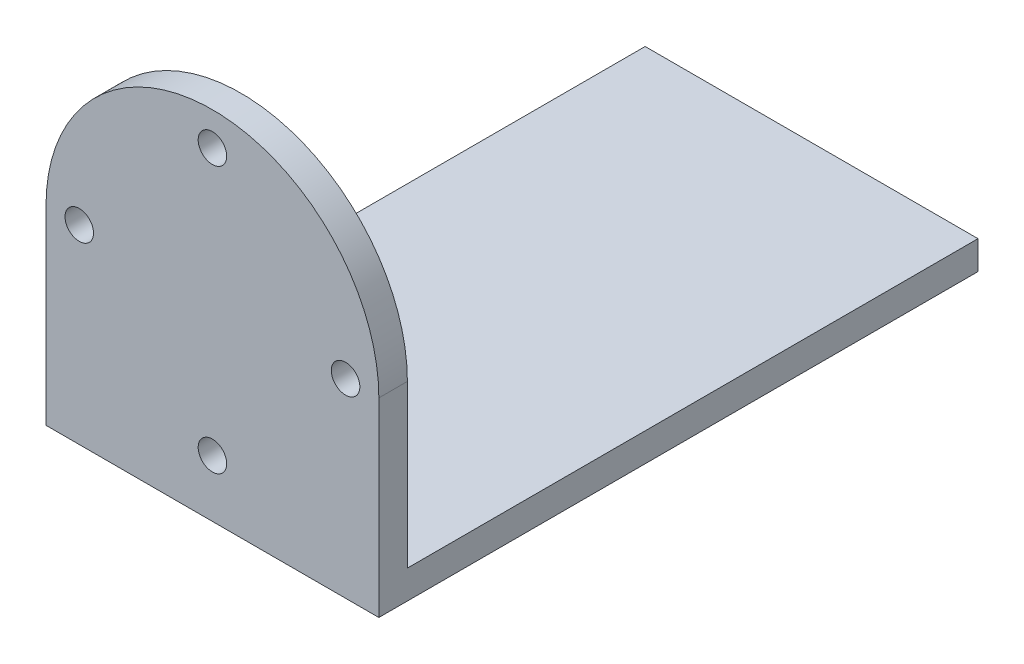
ISO-10303-21;
HEADER;
FILE_DESCRIPTION(('STEP AP214'),'2;1');
FILE_NAME('part.step','',(''),(''),'','','');
FILE_SCHEMA(('AUTOMOTIVE_DESIGN { 1 0 10303 214 1 1 1 1 }'));
ENDSEC;
DATA;
#1=APPLICATION_CONTEXT('core data for automotive mechanical design processes');
#2=APPLICATION_PROTOCOL_DEFINITION('international standard','automotive_design',2000,#1);
#3=PRODUCT_CONTEXT('',#1,'mechanical');
#4=PRODUCT('Part','Part','',(#3));
#5=PRODUCT_RELATED_PRODUCT_CATEGORY('part','',(#4));
#6=PRODUCT_DEFINITION_FORMATION('','',#4);
#7=PRODUCT_DEFINITION_CONTEXT('part definition',#1,'design');
#8=PRODUCT_DEFINITION('design','',#6,#7);
#9=PRODUCT_DEFINITION_SHAPE('','',#8);
#10=(LENGTH_UNIT() NAMED_UNIT(*) SI_UNIT(.MILLI.,.METRE.));
#11=(NAMED_UNIT(*) PLANE_ANGLE_UNIT() SI_UNIT($,.RADIAN.));
#12=(NAMED_UNIT(*) SI_UNIT($,.STERADIAN.) SOLID_ANGLE_UNIT());
#13=UNCERTAINTY_MEASURE_WITH_UNIT(LENGTH_MEASURE(1.E-05),#10,'distance_accuracy_value','');
#14=(GEOMETRIC_REPRESENTATION_CONTEXT(3) GLOBAL_UNCERTAINTY_ASSIGNED_CONTEXT((#13)) GLOBAL_UNIT_ASSIGNED_CONTEXT((#10,
#11,#12)) REPRESENTATION_CONTEXT('',''));
#15=CARTESIAN_POINT('',(0.,0.,0.));
#16=DIRECTION('',(0.,0.,1.));
#17=DIRECTION('',(1.,0.,0.));
#18=AXIS2_PLACEMENT_3D('',#15,#16,#17);
#19=CARTESIAN_POINT('',(0.,0.,0.));
#20=DIRECTION('',(0.,0.,1.));
#21=DIRECTION('',(1.,0.,0.));
#22=AXIS2_PLACEMENT_3D('',#19,#20,#21);
#23=PLANE('',#22);
#24=CARTESIAN_POINT('',(-14.,0.,0.));
#25=DIRECTION('',(0.,0.,1.));
#26=DIRECTION('',(1.,0.,0.));
#27=AXIS2_PLACEMENT_3D('',#24,#25,#26);
#28=CIRCLE('',#27,1.50000000000026);
#29=CARTESIAN_POINT('',(-12.4999999999997,0.,0.));
#30=VERTEX_POINT('',#29);
#31=EDGE_CURVE('E127',#30,#30,#28,.T.);
#32=ORIENTED_EDGE('',*,*,#31,.T.);
#33=EDGE_LOOP('',(#32));
#34=FACE_BOUND('',#33,.T.);
#35=CARTESIAN_POINT('',(0.,-14.,0.));
#36=DIRECTION('',(0.,0.,1.));
#37=DIRECTION('',(1.,0.,0.));
#38=AXIS2_PLACEMENT_3D('',#35,#36,#37);
#39=CIRCLE('',#38,1.50000000000075);
#40=CARTESIAN_POINT('',(1.50000000000076,-14.,0.));
#41=VERTEX_POINT('',#40);
#42=EDGE_CURVE('E139',#41,#41,#39,.T.);
#43=ORIENTED_EDGE('',*,*,#42,.T.);
#44=EDGE_LOOP('',(#43));
#45=FACE_BOUND('',#44,.T.);
#46=CARTESIAN_POINT('',(14.,0.,0.));
#47=DIRECTION('',(0.,0.,1.));
#48=DIRECTION('',(1.,0.,0.));
#49=AXIS2_PLACEMENT_3D('',#46,#47,#48);
#50=CIRCLE('',#49,1.50000000000049);
#51=CARTESIAN_POINT('',(15.5000000000005,0.,0.));
#52=VERTEX_POINT('',#51);
#53=EDGE_CURVE('E145',#52,#52,#50,.T.);
#54=ORIENTED_EDGE('',*,*,#53,.T.);
#55=EDGE_LOOP('',(#54));
#56=FACE_BOUND('',#55,.T.);
#57=CARTESIAN_POINT('',(0.,14.,0.));
#58=DIRECTION('',(0.,0.,1.));
#59=DIRECTION('',(1.,0.,0.));
#60=AXIS2_PLACEMENT_3D('',#57,#58,#59);
#61=CIRCLE('',#60,1.5);
#62=CARTESIAN_POINT('',(1.5,14.,0.));
#63=VERTEX_POINT('',#62);
#64=EDGE_CURVE('E153',#63,#63,#61,.T.);
#65=ORIENTED_EDGE('',*,*,#64,.T.);
#66=EDGE_LOOP('',(#65));
#67=FACE_BOUND('',#66,.T.);
#68=DIRECTION('',(1.,0.,0.));
#69=VECTOR('',#68,1.);
#70=CARTESIAN_POINT('',(17.5,-17.,0.));
#71=LINE('',#70,#69);
#72=CARTESIAN_POINT('',(-17.5,-17.,0.));
#73=VERTEX_POINT('',#72);
#74=CARTESIAN_POINT('',(17.5,-17.,0.));
#75=VERTEX_POINT('',#74);
#76=EDGE_CURVE('E55',#73,#75,#71,.T.);
#77=ORIENTED_EDGE('',*,*,#76,.F.);
#78=DIRECTION('',(0.,-1.,0.));
#79=VECTOR('',#78,1.);
#80=CARTESIAN_POINT('',(-17.5,0.,0.));
#81=LINE('',#80,#79);
#82=CARTESIAN_POINT('',(-17.5,0.,0.));
#83=VERTEX_POINT('',#82);
#84=EDGE_CURVE('E125',#83,#73,#81,.T.);
#85=ORIENTED_EDGE('',*,*,#84,.F.);
#86=CARTESIAN_POINT('',(0.,0.,0.));
#87=DIRECTION('',(0.,0.,1.));
#88=DIRECTION('',(1.,0.,0.));
#89=AXIS2_PLACEMENT_3D('',#86,#87,#88);
#90=CIRCLE('',#89,17.5);
#91=CARTESIAN_POINT('',(17.5,0.,0.));
#92=VERTEX_POINT('',#91);
#93=EDGE_CURVE('E79',#92,#83,#90,.T.);
#94=ORIENTED_EDGE('',*,*,#93,.F.);
#95=DIRECTION('',(0.,1.,0.));
#96=VECTOR('',#95,1.);
#97=CARTESIAN_POINT('',(17.5,-20.,0.));
#98=LINE('',#97,#96);
#99=EDGE_CURVE('E161',#75,#92,#98,.T.);
#100=ORIENTED_EDGE('',*,*,#99,.F.);
#101=EDGE_LOOP('',(#77,#85,#94,#100));
#102=FACE_BOUND('',#101,.T.);
#103=ADVANCED_FACE('F39',(#34,#45,#56,#67,#102),#23,.F.);
#104=CARTESIAN_POINT('',(0.,0.,3.));
#105=DIRECTION('',(0.,0.,1.));
#106=DIRECTION('',(1.,0.,0.));
#107=AXIS2_PLACEMENT_3D('',#104,#105,#106);
#108=PLANE('',#107);
#109=CARTESIAN_POINT('',(0.,-14.,3.));
#110=DIRECTION('',(0.,0.,1.));
#111=DIRECTION('',(1.,0.,0.));
#112=AXIS2_PLACEMENT_3D('',#109,#110,#111);
#113=CIRCLE('',#112,1.50000000000075);
#114=CARTESIAN_POINT('',(1.50000000000076,-14.,3.));
#115=VERTEX_POINT('',#114);
#116=EDGE_CURVE('E141',#115,#115,#113,.T.);
#117=ORIENTED_EDGE('',*,*,#116,.F.);
#118=EDGE_LOOP('',(#117));
#119=FACE_BOUND('',#118,.T.);
#120=CARTESIAN_POINT('',(0.,14.,3.));
#121=DIRECTION('',(0.,0.,1.));
#122=DIRECTION('',(1.,0.,0.));
#123=AXIS2_PLACEMENT_3D('',#120,#121,#122);
#124=CIRCLE('',#123,1.5);
#125=CARTESIAN_POINT('',(1.5,14.,3.));
#126=VERTEX_POINT('',#125);
#127=EDGE_CURVE('E157',#126,#126,#124,.T.);
#128=ORIENTED_EDGE('',*,*,#127,.F.);
#129=EDGE_LOOP('',(#128));
#130=FACE_BOUND('',#129,.T.);
#131=DIRECTION('',(0.,1.,0.));
#132=VECTOR('',#131,1.);
#133=CARTESIAN_POINT('',(17.5,-20.,3.));
#134=LINE('',#133,#132);
#135=CARTESIAN_POINT('',(17.5,-20.,3.));
#136=VERTEX_POINT('',#135);
#137=CARTESIAN_POINT('',(17.5,0.,3.));
#138=VERTEX_POINT('',#137);
#139=EDGE_CURVE('E165',#136,#138,#134,.T.);
#140=ORIENTED_EDGE('',*,*,#139,.T.);
#141=CARTESIAN_POINT('',(0.,0.,3.));
#142=DIRECTION('',(0.,0.,1.));
#143=DIRECTION('',(1.,0.,0.));
#144=AXIS2_PLACEMENT_3D('',#141,#142,#143);
#145=CIRCLE('',#144,17.5);
#146=CARTESIAN_POINT('',(-17.5,0.,3.));
#147=VERTEX_POINT('',#146);
#148=EDGE_CURVE('E84',#138,#147,#145,.T.);
#149=ORIENTED_EDGE('',*,*,#148,.T.);
#150=DIRECTION('',(0.,-1.,0.));
#151=VECTOR('',#150,1.);
#152=CARTESIAN_POINT('',(-17.5,0.,3.));
#153=LINE('',#152,#151);
#154=CARTESIAN_POINT('',(-17.5,-20.,3.));
#155=VERTEX_POINT('',#154);
#156=EDGE_CURVE('E170',#147,#155,#153,.T.);
#157=ORIENTED_EDGE('',*,*,#156,.T.);
#158=DIRECTION('',(1.,0.,0.));
#159=VECTOR('',#158,1.);
#160=CARTESIAN_POINT('',(-17.5,-20.,3.));
#161=LINE('',#160,#159);
#162=EDGE_CURVE('E64',#155,#136,#161,.T.);
#163=ORIENTED_EDGE('',*,*,#162,.T.);
#164=EDGE_LOOP('',(#140,#149,#157,#163));
#165=FACE_BOUND('',#164,.T.);
#166=CARTESIAN_POINT('',(14.,0.,3.));
#167=DIRECTION('',(0.,0.,1.));
#168=DIRECTION('',(1.,0.,0.));
#169=AXIS2_PLACEMENT_3D('',#166,#167,#168);
#170=CIRCLE('',#169,1.50000000000049);
#171=CARTESIAN_POINT('',(15.5000000000005,0.,3.));
#172=VERTEX_POINT('',#171);
#173=EDGE_CURVE('E149',#172,#172,#170,.T.);
#174=ORIENTED_EDGE('',*,*,#173,.F.);
#175=EDGE_LOOP('',(#174));
#176=FACE_BOUND('',#175,.T.);
#177=CARTESIAN_POINT('',(-14.,0.,3.));
#178=DIRECTION('',(0.,0.,1.));
#179=DIRECTION('',(1.,0.,0.));
#180=AXIS2_PLACEMENT_3D('',#177,#178,#179);
#181=CIRCLE('',#180,1.50000000000026);
#182=CARTESIAN_POINT('',(-12.4999999999997,0.,3.));
#183=VERTEX_POINT('',#182);
#184=EDGE_CURVE('E132',#183,#183,#181,.T.);
#185=ORIENTED_EDGE('',*,*,#184,.F.);
#186=EDGE_LOOP('',(#185));
#187=FACE_BOUND('',#186,.T.);
#188=ADVANCED_FACE('F212',(#119,#130,#165,#176,#187),#108,.T.);
#189=CARTESIAN_POINT('',(17.5,-20.,3.));
#190=DIRECTION('',(-1.,0.,0.));
#191=DIRECTION('',(0.,0.,1.));
#192=AXIS2_PLACEMENT_3D('',#189,#190,#191);
#193=PLANE('',#192);
#194=DIRECTION('',(0.,0.,-1.));
#195=VECTOR('',#194,1.);
#196=CARTESIAN_POINT('',(17.5,-20.,3.));
#197=LINE('',#196,#195);
#198=CARTESIAN_POINT('',(17.5,-20.,-60.));
#199=VERTEX_POINT('',#198);
#200=EDGE_CURVE('E175',#136,#199,#197,.T.);
#201=ORIENTED_EDGE('',*,*,#200,.T.);
#202=DIRECTION('',(0.,-1.,0.));
#203=VECTOR('',#202,1.);
#204=CARTESIAN_POINT('',(17.5,-20.,-60.));
#205=LINE('',#204,#203);
#206=CARTESIAN_POINT('',(17.5,-17.,-60.));
#207=VERTEX_POINT('',#206);
#208=EDGE_CURVE('E112',#207,#199,#205,.T.);
#209=ORIENTED_EDGE('',*,*,#208,.F.);
#210=DIRECTION('',(0.,0.,1.));
#211=VECTOR('',#210,1.);
#212=CARTESIAN_POINT('',(17.5,-17.,-60.));
#213=LINE('',#212,#211);
#214=EDGE_CURVE('E107',#207,#75,#213,.T.);
#215=ORIENTED_EDGE('',*,*,#214,.T.);
#216=ORIENTED_EDGE('',*,*,#99,.T.);
#217=DIRECTION('',(0.,0.,-1.));
#218=VECTOR('',#217,1.);
#219=CARTESIAN_POINT('',(17.5,0.,3.));
#220=LINE('',#219,#218);
#221=EDGE_CURVE('E11',#138,#92,#220,.T.);
#222=ORIENTED_EDGE('',*,*,#221,.F.);
#223=ORIENTED_EDGE('',*,*,#139,.F.);
#224=EDGE_LOOP('',(#201,#209,#215,#216,#222,#223));
#225=FACE_BOUND('',#224,.T.);
#226=ADVANCED_FACE('F41',(#225),#193,.F.);
#227=CARTESIAN_POINT('',(0.,0.,3.));
#228=DIRECTION('',(0.,0.,-1.));
#229=DIRECTION('',(-1.,0.,0.));
#230=AXIS2_PLACEMENT_3D('',#227,#228,#229);
#231=CYLINDRICAL_SURFACE('',#230,17.5);
#232=ORIENTED_EDGE('',*,*,#93,.T.);
#233=DIRECTION('',(0.,0.,-1.));
#234=VECTOR('',#233,1.);
#235=CARTESIAN_POINT('',(-17.5,0.,3.));
#236=LINE('',#235,#234);
#237=EDGE_CURVE('E48',#147,#83,#236,.T.);
#238=ORIENTED_EDGE('',*,*,#237,.F.);
#239=ORIENTED_EDGE('',*,*,#148,.F.);
#240=ORIENTED_EDGE('',*,*,#221,.T.);
#241=EDGE_LOOP('',(#232,#238,#239,#240));
#242=FACE_BOUND('',#241,.T.);
#243=ADVANCED_FACE('F189',(#242),#231,.T.);
#244=CARTESIAN_POINT('',(-17.5,0.,3.));
#245=DIRECTION('',(1.,0.,0.));
#246=DIRECTION('',(0.,0.,-1.));
#247=AXIS2_PLACEMENT_3D('',#244,#245,#246);
#248=PLANE('',#247);
#249=ORIENTED_EDGE('',*,*,#84,.T.);
#250=DIRECTION('',(0.,0.,1.));
#251=VECTOR('',#250,1.);
#252=CARTESIAN_POINT('',(-17.5,-17.,-60.));
#253=LINE('',#252,#251);
#254=CARTESIAN_POINT('',(-17.5,-17.,-60.));
#255=VERTEX_POINT('',#254);
#256=EDGE_CURVE('E105',#255,#73,#253,.T.);
#257=ORIENTED_EDGE('',*,*,#256,.F.);
#258=DIRECTION('',(0.,1.,0.));
#259=VECTOR('',#258,1.);
#260=CARTESIAN_POINT('',(-17.5,-17.,-60.));
#261=LINE('',#260,#259);
#262=CARTESIAN_POINT('',(-17.5,-20.,-60.));
#263=VERTEX_POINT('',#262);
#264=EDGE_CURVE('E113',#263,#255,#261,.T.);
#265=ORIENTED_EDGE('',*,*,#264,.F.);
#266=DIRECTION('',(0.,0.,-1.));
#267=VECTOR('',#266,1.);
#268=CARTESIAN_POINT('',(-17.5,-20.,3.));
#269=LINE('',#268,#267);
#270=EDGE_CURVE('E184',#155,#263,#269,.T.);
#271=ORIENTED_EDGE('',*,*,#270,.F.);
#272=ORIENTED_EDGE('',*,*,#156,.F.);
#273=ORIENTED_EDGE('',*,*,#237,.T.);
#274=EDGE_LOOP('',(#249,#257,#265,#271,#272,#273));
#275=FACE_BOUND('',#274,.T.);
#276=ADVANCED_FACE('F124',(#275),#248,.F.);
#277=CARTESIAN_POINT('',(-17.5,-20.,3.));
#278=DIRECTION('',(0.,1.,0.));
#279=DIRECTION('',(0.,0.,1.));
#280=AXIS2_PLACEMENT_3D('',#277,#278,#279);
#281=PLANE('',#280);
#282=ORIENTED_EDGE('',*,*,#270,.T.);
#283=DIRECTION('',(-1.,0.,0.));
#284=VECTOR('',#283,1.);
#285=CARTESIAN_POINT('',(-17.5,-20.,-60.));
#286=LINE('',#285,#284);
#287=EDGE_CURVE('E119',#199,#263,#286,.T.);
#288=ORIENTED_EDGE('',*,*,#287,.F.);
#289=ORIENTED_EDGE('',*,*,#200,.F.);
#290=ORIENTED_EDGE('',*,*,#162,.F.);
#291=EDGE_LOOP('',(#282,#288,#289,#290));
#292=FACE_BOUND('',#291,.T.);
#293=ADVANCED_FACE('F198',(#292),#281,.F.);
#294=CARTESIAN_POINT('',(0.,14.,3.));
#295=DIRECTION('',(0.,0.,-1.));
#296=DIRECTION('',(-1.,0.,0.));
#297=AXIS2_PLACEMENT_3D('',#294,#295,#296);
#298=CYLINDRICAL_SURFACE('',#297,1.5);
#299=ORIENTED_EDGE('',*,*,#127,.T.);
#300=EDGE_LOOP('',(#299));
#301=FACE_BOUND('',#300,.T.);
#302=ORIENTED_EDGE('',*,*,#64,.F.);
#303=EDGE_LOOP('',(#302));
#304=FACE_BOUND('',#303,.T.);
#305=ADVANCED_FACE('F200',(#301,#304),#298,.F.);
#306=CARTESIAN_POINT('',(14.,0.,3.));
#307=DIRECTION('',(0.,0.,-1.));
#308=DIRECTION('',(-1.,0.,0.));
#309=AXIS2_PLACEMENT_3D('',#306,#307,#308);
#310=CYLINDRICAL_SURFACE('',#309,1.50000000000049);
#311=ORIENTED_EDGE('',*,*,#173,.T.);
#312=EDGE_LOOP('',(#311));
#313=FACE_BOUND('',#312,.T.);
#314=ORIENTED_EDGE('',*,*,#53,.F.);
#315=EDGE_LOOP('',(#314));
#316=FACE_BOUND('',#315,.T.);
#317=ADVANCED_FACE('F206',(#313,#316),#310,.F.);
#318=CARTESIAN_POINT('',(0.,-14.,3.));
#319=DIRECTION('',(0.,0.,-1.));
#320=DIRECTION('',(-1.,0.,0.));
#321=AXIS2_PLACEMENT_3D('',#318,#319,#320);
#322=CYLINDRICAL_SURFACE('',#321,1.50000000000075);
#323=ORIENTED_EDGE('',*,*,#116,.T.);
#324=EDGE_LOOP('',(#323));
#325=FACE_BOUND('',#324,.T.);
#326=ORIENTED_EDGE('',*,*,#42,.F.);
#327=EDGE_LOOP('',(#326));
#328=FACE_BOUND('',#327,.T.);
#329=ADVANCED_FACE('F223',(#325,#328),#322,.F.);
#330=CARTESIAN_POINT('',(-14.,0.,3.));
#331=DIRECTION('',(0.,0.,-1.));
#332=DIRECTION('',(-1.,0.,0.));
#333=AXIS2_PLACEMENT_3D('',#330,#331,#332);
#334=CYLINDRICAL_SURFACE('',#333,1.50000000000026);
#335=ORIENTED_EDGE('',*,*,#184,.T.);
#336=EDGE_LOOP('',(#335));
#337=FACE_BOUND('',#336,.T.);
#338=ORIENTED_EDGE('',*,*,#31,.F.);
#339=EDGE_LOOP('',(#338));
#340=FACE_BOUND('',#339,.T.);
#341=ADVANCED_FACE('F227',(#337,#340),#334,.F.);
#342=CARTESIAN_POINT('',(17.5,-17.,-60.));
#343=DIRECTION('',(0.,-1.,0.));
#344=DIRECTION('',(0.,0.,-1.));
#345=AXIS2_PLACEMENT_3D('',#342,#343,#344);
#346=PLANE('',#345);
#347=ORIENTED_EDGE('',*,*,#76,.T.);
#348=ORIENTED_EDGE('',*,*,#214,.F.);
#349=DIRECTION('',(1.,0.,0.));
#350=VECTOR('',#349,1.);
#351=CARTESIAN_POINT('',(17.5,-17.,-60.));
#352=LINE('',#351,#350);
#353=EDGE_CURVE('E101',#255,#207,#352,.T.);
#354=ORIENTED_EDGE('',*,*,#353,.F.);
#355=ORIENTED_EDGE('',*,*,#256,.T.);
#356=EDGE_LOOP('',(#347,#348,#354,#355));
#357=FACE_BOUND('',#356,.T.);
#358=ADVANCED_FACE('F103',(#357),#346,.F.);
#359=CARTESIAN_POINT('',(0.,0.,-60.));
#360=DIRECTION('',(0.,0.,1.));
#361=DIRECTION('',(1.,0.,0.));
#362=AXIS2_PLACEMENT_3D('',#359,#360,#361);
#363=PLANE('',#362);
#364=ORIENTED_EDGE('',*,*,#264,.T.);
#365=ORIENTED_EDGE('',*,*,#353,.T.);
#366=ORIENTED_EDGE('',*,*,#208,.T.);
#367=ORIENTED_EDGE('',*,*,#287,.T.);
#368=EDGE_LOOP('',(#364,#365,#366,#367));
#369=FACE_BOUND('',#368,.T.);
#370=ADVANCED_FACE('F117',(#369),#363,.F.);
#371=CLOSED_SHELL('',(#103,#188,#226,#243,#276,#293,#305,#317,#329,#341,#358,#370));
#372=MANIFOLD_SOLID_BREP('B2',#371);
#373=ADVANCED_BREP_SHAPE_REPRESENTATION('',(#18,#372),#14);
#374=SHAPE_DEFINITION_REPRESENTATION(#9,#373);
ENDSEC;
END-ISO-10303-21;
